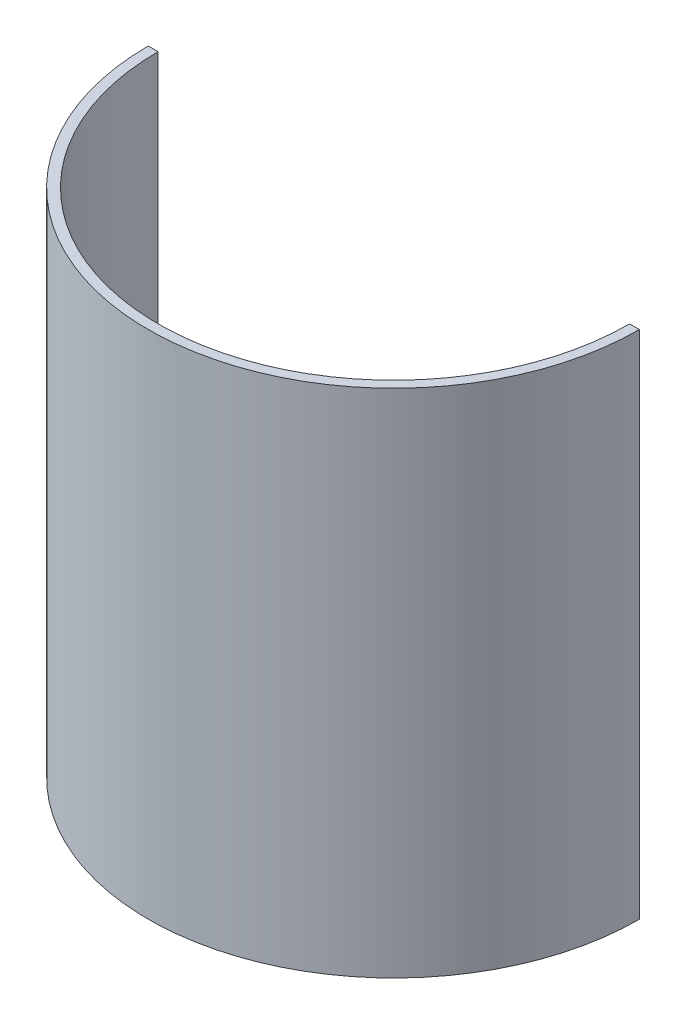
ISO-10303-21;
HEADER;
FILE_DESCRIPTION(('STEP AP214'),'2;1');
FILE_NAME('part.step','',(''),(''),'','','');
FILE_SCHEMA(('AUTOMOTIVE_DESIGN { 1 0 10303 214 1 1 1 1 }'));
ENDSEC;
DATA;
#1=APPLICATION_CONTEXT('core data for automotive mechanical design processes');
#2=APPLICATION_PROTOCOL_DEFINITION('international standard','automotive_design',2000,#1);
#3=PRODUCT_CONTEXT('',#1,'mechanical');
#4=PRODUCT('Part','Part','',(#3));
#5=PRODUCT_RELATED_PRODUCT_CATEGORY('part','',(#4));
#6=PRODUCT_DEFINITION_FORMATION('','',#4);
#7=PRODUCT_DEFINITION_CONTEXT('part definition',#1,'design');
#8=PRODUCT_DEFINITION('design','',#6,#7);
#9=PRODUCT_DEFINITION_SHAPE('','',#8);
#10=(LENGTH_UNIT() NAMED_UNIT(*) SI_UNIT(.MILLI.,.METRE.));
#11=(NAMED_UNIT(*) PLANE_ANGLE_UNIT() SI_UNIT($,.RADIAN.));
#12=(NAMED_UNIT(*) SI_UNIT($,.STERADIAN.) SOLID_ANGLE_UNIT());
#13=UNCERTAINTY_MEASURE_WITH_UNIT(LENGTH_MEASURE(1.E-05),#10,'distance_accuracy_value','');
#14=(GEOMETRIC_REPRESENTATION_CONTEXT(3) GLOBAL_UNCERTAINTY_ASSIGNED_CONTEXT((#13)) GLOBAL_UNIT_ASSIGNED_CONTEXT((#10,
#11,#12)) REPRESENTATION_CONTEXT('',''));
#15=CARTESIAN_POINT('',(0.,0.,0.));
#16=DIRECTION('',(0.,0.,1.));
#17=DIRECTION('',(1.,0.,0.));
#18=AXIS2_PLACEMENT_3D('',#15,#16,#17);
#19=CARTESIAN_POINT('',(0.,26.,0.));
#20=DIRECTION('',(0.,-1.,0.));
#21=DIRECTION('',(0.,0.,-1.));
#22=AXIS2_PLACEMENT_3D('',#19,#20,#21);
#23=CYLINDRICAL_SURFACE('',#22,12.5);
#24=CARTESIAN_POINT('',(0.,0.,0.));
#25=DIRECTION('',(0.,1.,0.));
#26=DIRECTION('',(0.,0.,1.));
#27=AXIS2_PLACEMENT_3D('',#24,#25,#26);
#28=CIRCLE('',#27,12.5);
#29=CARTESIAN_POINT('',(-12.5,0.,0.));
#30=VERTEX_POINT('',#29);
#31=CARTESIAN_POINT('',(12.5,0.,0.));
#32=VERTEX_POINT('',#31);
#33=EDGE_CURVE('E97',#30,#32,#28,.T.);
#34=ORIENTED_EDGE('',*,*,#33,.T.);
#35=DIRECTION('',(0.,-1.,0.));
#36=VECTOR('',#35,1.);
#37=CARTESIAN_POINT('',(12.5,26.,0.));
#38=LINE('',#37,#36);
#39=CARTESIAN_POINT('',(12.5,26.,0.));
#40=VERTEX_POINT('',#39);
#41=EDGE_CURVE('E11',#40,#32,#38,.T.);
#42=ORIENTED_EDGE('',*,*,#41,.F.);
#43=CARTESIAN_POINT('',(0.,26.,0.));
#44=DIRECTION('',(0.,1.,0.));
#45=DIRECTION('',(0.,0.,1.));
#46=AXIS2_PLACEMENT_3D('',#43,#44,#45);
#47=CIRCLE('',#46,12.5);
#48=CARTESIAN_POINT('',(-12.5,26.,0.));
#49=VERTEX_POINT('',#48);
#50=EDGE_CURVE('E85',#49,#40,#47,.T.);
#51=ORIENTED_EDGE('',*,*,#50,.F.);
#52=DIRECTION('',(0.,-1.,0.));
#53=VECTOR('',#52,1.);
#54=CARTESIAN_POINT('',(-12.5,26.,0.));
#55=LINE('',#54,#53);
#56=EDGE_CURVE('E93',#49,#30,#55,.T.);
#57=ORIENTED_EDGE('',*,*,#56,.T.);
#58=EDGE_LOOP('',(#34,#42,#51,#57));
#59=FACE_BOUND('',#58,.T.);
#60=ADVANCED_FACE('F34',(#59),#23,.T.);
#61=CARTESIAN_POINT('',(12.,26.,0.));
#62=DIRECTION('',(0.,0.,1.));
#63=DIRECTION('',(1.,0.,0.));
#64=AXIS2_PLACEMENT_3D('',#61,#62,#63);
#65=PLANE('',#64);
#66=DIRECTION('',(-1.,0.,0.));
#67=VECTOR('',#66,1.);
#68=CARTESIAN_POINT('',(12.,0.,0.));
#69=LINE('',#68,#67);
#70=CARTESIAN_POINT('',(12.,0.,0.));
#71=VERTEX_POINT('',#70);
#72=EDGE_CURVE('E89',#32,#71,#69,.T.);
#73=ORIENTED_EDGE('',*,*,#72,.T.);
#74=DIRECTION('',(0.,-1.,0.));
#75=VECTOR('',#74,1.);
#76=CARTESIAN_POINT('',(12.,26.,0.));
#77=LINE('',#76,#75);
#78=CARTESIAN_POINT('',(12.,26.,0.));
#79=VERTEX_POINT('',#78);
#80=EDGE_CURVE('E42',#79,#71,#77,.T.);
#81=ORIENTED_EDGE('',*,*,#80,.F.);
#82=DIRECTION('',(-1.,0.,0.));
#83=VECTOR('',#82,1.);
#84=CARTESIAN_POINT('',(12.,26.,0.));
#85=LINE('',#84,#83);
#86=EDGE_CURVE('E80',#40,#79,#85,.T.);
#87=ORIENTED_EDGE('',*,*,#86,.F.);
#88=ORIENTED_EDGE('',*,*,#41,.T.);
#89=EDGE_LOOP('',(#73,#81,#87,#88));
#90=FACE_BOUND('',#89,.T.);
#91=ADVANCED_FACE('F88',(#90),#65,.F.);
#92=CARTESIAN_POINT('',(0.,26.,0.));
#93=DIRECTION('',(0.,-1.,0.));
#94=DIRECTION('',(0.,0.,-1.));
#95=AXIS2_PLACEMENT_3D('',#92,#93,#94);
#96=CYLINDRICAL_SURFACE('',#95,12.);
#97=CARTESIAN_POINT('',(0.,0.,0.));
#98=DIRECTION('',(0.,-1.,0.));
#99=DIRECTION('',(0.,0.,1.));
#100=AXIS2_PLACEMENT_3D('',#97,#98,#99);
#101=CIRCLE('',#100,12.);
#102=CARTESIAN_POINT('',(-12.,0.,0.));
#103=VERTEX_POINT('',#102);
#104=EDGE_CURVE('E67',#71,#103,#101,.T.);
#105=ORIENTED_EDGE('',*,*,#104,.T.);
#106=DIRECTION('',(0.,-1.,0.));
#107=VECTOR('',#106,1.);
#108=CARTESIAN_POINT('',(-12.,26.,0.));
#109=LINE('',#108,#107);
#110=CARTESIAN_POINT('',(-12.,26.,0.));
#111=VERTEX_POINT('',#110);
#112=EDGE_CURVE('E90',#111,#103,#109,.T.);
#113=ORIENTED_EDGE('',*,*,#112,.F.);
#114=CARTESIAN_POINT('',(0.,26.,0.));
#115=DIRECTION('',(0.,-1.,0.));
#116=DIRECTION('',(0.,0.,1.));
#117=AXIS2_PLACEMENT_3D('',#114,#115,#116);
#118=CIRCLE('',#117,12.);
#119=EDGE_CURVE('E83',#79,#111,#118,.T.);
#120=ORIENTED_EDGE('',*,*,#119,.F.);
#121=ORIENTED_EDGE('',*,*,#80,.T.);
#122=EDGE_LOOP('',(#105,#113,#120,#121));
#123=FACE_BOUND('',#122,.T.);
#124=ADVANCED_FACE('F91',(#123),#96,.F.);
#125=CARTESIAN_POINT('',(-12.5,26.,0.));
#126=DIRECTION('',(0.,0.,1.));
#127=DIRECTION('',(1.,0.,0.));
#128=AXIS2_PLACEMENT_3D('',#125,#126,#127);
#129=PLANE('',#128);
#130=DIRECTION('',(-1.,0.,0.));
#131=VECTOR('',#130,1.);
#132=CARTESIAN_POINT('',(-12.5,0.,0.));
#133=LINE('',#132,#131);
#134=EDGE_CURVE('E73',#103,#30,#133,.T.);
#135=ORIENTED_EDGE('',*,*,#134,.T.);
#136=ORIENTED_EDGE('',*,*,#56,.F.);
#137=DIRECTION('',(-1.,0.,0.));
#138=VECTOR('',#137,1.);
#139=CARTESIAN_POINT('',(-12.5,26.,0.));
#140=LINE('',#139,#138);
#141=EDGE_CURVE('E50',#111,#49,#140,.T.);
#142=ORIENTED_EDGE('',*,*,#141,.F.);
#143=ORIENTED_EDGE('',*,*,#112,.T.);
#144=EDGE_LOOP('',(#135,#136,#142,#143));
#145=FACE_BOUND('',#144,.T.);
#146=ADVANCED_FACE('F104',(#145),#129,.F.);
#147=CARTESIAN_POINT('',(0.,26.,0.));
#148=DIRECTION('',(0.,1.,0.));
#149=DIRECTION('',(0.,0.,1.));
#150=AXIS2_PLACEMENT_3D('',#147,#148,#149);
#151=PLANE('',#150);
#152=ORIENTED_EDGE('',*,*,#50,.T.);
#153=ORIENTED_EDGE('',*,*,#86,.T.);
#154=ORIENTED_EDGE('',*,*,#119,.T.);
#155=ORIENTED_EDGE('',*,*,#141,.T.);
#156=EDGE_LOOP('',(#152,#153,#154,#155));
#157=FACE_BOUND('',#156,.T.);
#158=ADVANCED_FACE('F81',(#157),#151,.T.);
#159=CARTESIAN_POINT('',(0.,0.,0.));
#160=DIRECTION('',(0.,1.,0.));
#161=DIRECTION('',(0.,0.,1.));
#162=AXIS2_PLACEMENT_3D('',#159,#160,#161);
#163=PLANE('',#162);
#164=ORIENTED_EDGE('',*,*,#33,.F.);
#165=ORIENTED_EDGE('',*,*,#134,.F.);
#166=ORIENTED_EDGE('',*,*,#104,.F.);
#167=ORIENTED_EDGE('',*,*,#72,.F.);
#168=EDGE_LOOP('',(#164,#165,#166,#167));
#169=FACE_BOUND('',#168,.T.);
#170=ADVANCED_FACE('F107',(#169),#163,.F.);
#171=CLOSED_SHELL('',(#60,#91,#124,#146,#158,#170));
#172=MANIFOLD_SOLID_BREP('B2',#171);
#173=ADVANCED_BREP_SHAPE_REPRESENTATION('',(#18,#172),#14);
#174=SHAPE_DEFINITION_REPRESENTATION(#9,#173);
ENDSEC;
END-ISO-10303-21;
